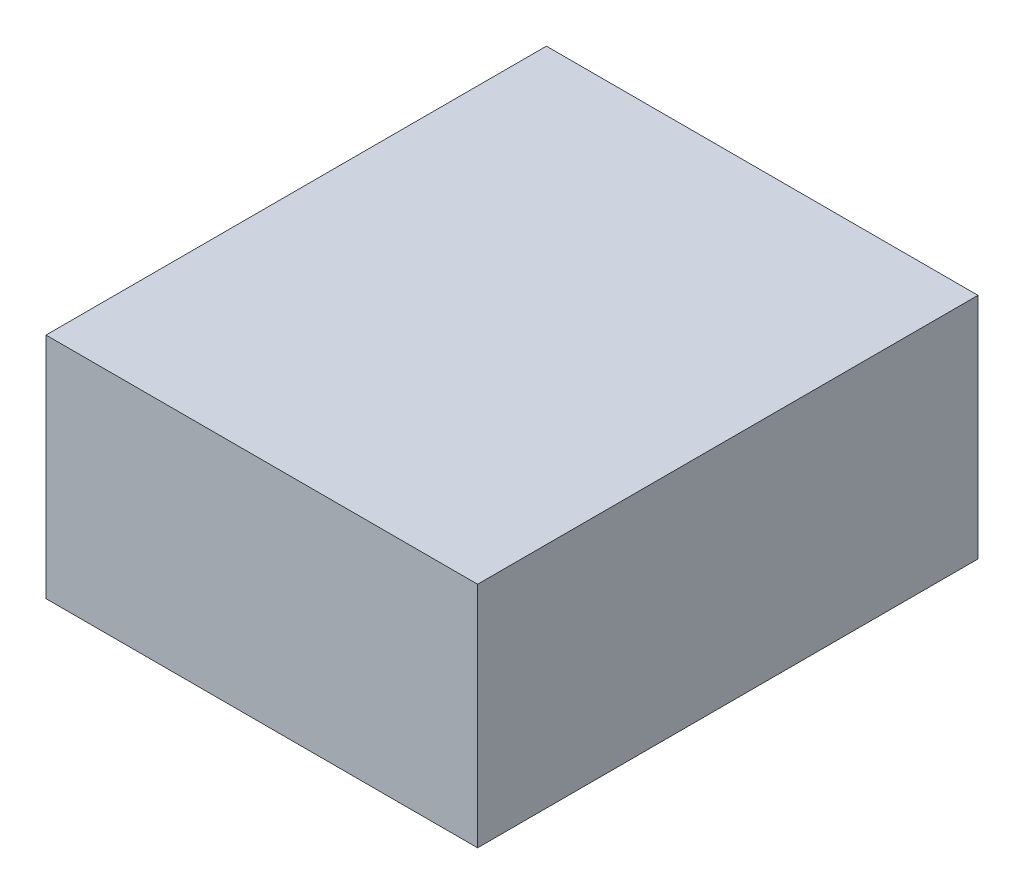
ISO-10303-21;
HEADER;
FILE_DESCRIPTION(('STEP AP214'),'2;1');
FILE_NAME('part.step','',(''),(''),'','','');
FILE_SCHEMA(('AUTOMOTIVE_DESIGN { 1 0 10303 214 1 1 1 1 }'));
ENDSEC;
DATA;
#1=APPLICATION_CONTEXT('core data for automotive mechanical design processes');
#2=APPLICATION_PROTOCOL_DEFINITION('international standard','automotive_design',2000,#1);
#3=PRODUCT_CONTEXT('',#1,'mechanical');
#4=PRODUCT('Part','Part','',(#3));
#5=PRODUCT_RELATED_PRODUCT_CATEGORY('part','',(#4));
#6=PRODUCT_DEFINITION_FORMATION('','',#4);
#7=PRODUCT_DEFINITION_CONTEXT('part definition',#1,'design');
#8=PRODUCT_DEFINITION('design','',#6,#7);
#9=PRODUCT_DEFINITION_SHAPE('','',#8);
#10=(LENGTH_UNIT() NAMED_UNIT(*) SI_UNIT(.MILLI.,.METRE.));
#11=(NAMED_UNIT(*) PLANE_ANGLE_UNIT() SI_UNIT($,.RADIAN.));
#12=(NAMED_UNIT(*) SI_UNIT($,.STERADIAN.) SOLID_ANGLE_UNIT());
#13=UNCERTAINTY_MEASURE_WITH_UNIT(LENGTH_MEASURE(1.E-05),#10,'distance_accuracy_value','');
#14=(GEOMETRIC_REPRESENTATION_CONTEXT(3) GLOBAL_UNCERTAINTY_ASSIGNED_CONTEXT((#13)) GLOBAL_UNIT_ASSIGNED_CONTEXT((#10,
#11,#12)) REPRESENTATION_CONTEXT('',''));
#15=CARTESIAN_POINT('',(0.,0.,0.));
#16=DIRECTION('',(0.,0.,1.));
#17=DIRECTION('',(1.,0.,0.));
#18=AXIS2_PLACEMENT_3D('',#15,#16,#17);
#19=CARTESIAN_POINT('',(3.175,0.,508.));
#20=DIRECTION('',(-1.,0.,0.));
#21=DIRECTION('',(0.,0.,1.));
#22=AXIS2_PLACEMENT_3D('',#19,#20,#21);
#23=PLANE('',#22);
#24=DIRECTION('',(0.,1.,0.));
#25=VECTOR('',#24,1.);
#26=CARTESIAN_POINT('',(3.175,0.,504.825));
#27=LINE('',#26,#25);
#28=CARTESIAN_POINT('',(3.17499999999998,-127.,504.825));
#29=VERTEX_POINT('',#28);
#30=CARTESIAN_POINT('',(3.175,101.6,504.825));
#31=VERTEX_POINT('',#30);
#32=EDGE_CURVE('E137',#29,#31,#27,.T.);
#33=ORIENTED_EDGE('',*,*,#32,.F.);
#34=DIRECTION('',(0.,0.,-1.));
#35=VECTOR('',#34,1.);
#36=CARTESIAN_POINT('',(3.17499999999998,-127.,165.1));
#37=LINE('',#36,#35);
#38=CARTESIAN_POINT('',(3.17499999999998,-127.,165.1));
#39=VERTEX_POINT('',#38);
#40=EDGE_CURVE('E147',#29,#39,#37,.T.);
#41=ORIENTED_EDGE('',*,*,#40,.T.);
#42=DIRECTION('',(0.,1.,0.));
#43=VECTOR('',#42,1.);
#44=CARTESIAN_POINT('',(3.17499999999998,-76.2,165.1));
#45=LINE('',#44,#43);
#46=CARTESIAN_POINT('',(3.17499999999998,-76.2,165.1));
#47=VERTEX_POINT('',#46);
#48=EDGE_CURVE('E159',#39,#47,#45,.T.);
#49=ORIENTED_EDGE('',*,*,#48,.T.);
#50=DIRECTION('',(0.,0.,-1.));
#51=VECTOR('',#50,1.);
#52=CARTESIAN_POINT('',(3.17499999999998,-76.2,139.7));
#53=LINE('',#52,#51);
#54=CARTESIAN_POINT('',(3.17499999999998,-76.2,139.7));
#55=VERTEX_POINT('',#54);
#56=EDGE_CURVE('E161',#47,#55,#53,.T.);
#57=ORIENTED_EDGE('',*,*,#56,.T.);
#58=CARTESIAN_POINT('',(3.17499999999998,-76.2,63.5));
#59=DIRECTION('',(-1.,0.,0.));
#60=DIRECTION('',(0.,0.,1.));
#61=AXIS2_PLACEMENT_3D('',#58,#59,#60);
#62=CIRCLE('',#61,76.2);
#63=CARTESIAN_POINT('',(3.17499999999998,0.,63.5));
#64=VERTEX_POINT('',#63);
#65=EDGE_CURVE('E158',#55,#64,#62,.T.);
#66=ORIENTED_EDGE('',*,*,#65,.T.);
#67=DIRECTION('',(0.,0.,-1.));
#68=VECTOR('',#67,1.);
#69=CARTESIAN_POINT('',(3.175,0.,508.));
#70=LINE('',#69,#68);
#71=CARTESIAN_POINT('',(3.175,0.,0.));
#72=VERTEX_POINT('',#71);
#73=EDGE_CURVE('E48',#64,#72,#70,.T.);
#74=ORIENTED_EDGE('',*,*,#73,.T.);
#75=DIRECTION('',(0.,1.,0.));
#76=VECTOR('',#75,1.);
#77=CARTESIAN_POINT('',(3.175,0.,0.));
#78=LINE('',#77,#76);
#79=CARTESIAN_POINT('',(3.175,101.6,0.));
#80=VERTEX_POINT('',#79);
#81=EDGE_CURVE('E197',#72,#80,#78,.T.);
#82=ORIENTED_EDGE('',*,*,#81,.T.);
#83=DIRECTION('',(0.,0.,-1.));
#84=VECTOR('',#83,1.);
#85=CARTESIAN_POINT('',(3.175,101.6,508.));
#86=LINE('',#85,#84);
#87=EDGE_CURVE('E150',#31,#80,#86,.T.);
#88=ORIENTED_EDGE('',*,*,#87,.F.);
#89=EDGE_LOOP('',(#33,#41,#49,#57,#66,#74,#82,#88));
#90=FACE_BOUND('',#89,.T.);
#91=ADVANCED_FACE('F39',(#90),#23,.F.);
#92=CARTESIAN_POINT('',(3.175,101.6,508.));
#93=DIRECTION('',(0.,1.,0.));
#94=DIRECTION('',(0.,0.,1.));
#95=AXIS2_PLACEMENT_3D('',#92,#93,#94);
#96=PLANE('',#95);
#97=DIRECTION('',(1.,0.,0.));
#98=VECTOR('',#97,1.);
#99=CARTESIAN_POINT('',(3.175,101.6,504.825));
#100=LINE('',#99,#98);
#101=CARTESIAN_POINT('',(434.975,101.6,504.825));
#102=VERTEX_POINT('',#101);
#103=EDGE_CURVE('E152',#31,#102,#100,.T.);
#104=ORIENTED_EDGE('',*,*,#103,.F.);
#105=ORIENTED_EDGE('',*,*,#87,.T.);
#106=DIRECTION('',(1.,0.,0.));
#107=VECTOR('',#106,1.);
#108=CARTESIAN_POINT('',(3.175,101.6,0.));
#109=LINE('',#108,#107);
#110=CARTESIAN_POINT('',(434.975,101.6,0.));
#111=VERTEX_POINT('',#110);
#112=EDGE_CURVE('E199',#80,#111,#109,.T.);
#113=ORIENTED_EDGE('',*,*,#112,.T.);
#114=DIRECTION('',(0.,0.,-1.));
#115=VECTOR('',#114,1.);
#116=CARTESIAN_POINT('',(434.975,101.6,508.));
#117=LINE('',#116,#115);
#118=EDGE_CURVE('E217',#102,#111,#117,.T.);
#119=ORIENTED_EDGE('',*,*,#118,.F.);
#120=EDGE_LOOP('',(#104,#105,#113,#119));
#121=FACE_BOUND('',#120,.T.);
#122=ADVANCED_FACE('F235',(#121),#96,.F.);
#123=CARTESIAN_POINT('',(434.975,101.6,508.));
#124=DIRECTION('',(1.,0.,0.));
#125=DIRECTION('',(0.,1.,0.));
#126=AXIS2_PLACEMENT_3D('',#123,#124,#125);
#127=PLANE('',#126);
#128=DIRECTION('',(0.,-1.,0.));
#129=VECTOR('',#128,1.);
#130=CARTESIAN_POINT('',(434.975,101.6,504.825));
#131=LINE('',#130,#129);
#132=CARTESIAN_POINT('',(434.975,-127.,504.825));
#133=VERTEX_POINT('',#132);
#134=EDGE_CURVE('E140',#102,#133,#131,.T.);
#135=ORIENTED_EDGE('',*,*,#134,.F.);
#136=ORIENTED_EDGE('',*,*,#118,.T.);
#137=DIRECTION('',(0.,-1.,0.));
#138=VECTOR('',#137,1.);
#139=CARTESIAN_POINT('',(434.975,101.6,0.));
#140=LINE('',#139,#138);
#141=CARTESIAN_POINT('',(434.975,-127.,0.));
#142=VERTEX_POINT('',#141);
#143=EDGE_CURVE('E202',#111,#142,#140,.T.);
#144=ORIENTED_EDGE('',*,*,#143,.T.);
#145=DIRECTION('',(0.,0.,-1.));
#146=VECTOR('',#145,1.);
#147=CARTESIAN_POINT('',(434.975,-127.,508.));
#148=LINE('',#147,#146);
#149=EDGE_CURVE('E215',#133,#142,#148,.T.);
#150=ORIENTED_EDGE('',*,*,#149,.F.);
#151=EDGE_LOOP('',(#135,#136,#144,#150));
#152=FACE_BOUND('',#151,.T.);
#153=ADVANCED_FACE('F239',(#152),#127,.F.);
#154=CARTESIAN_POINT('',(0.,0.,508.));
#155=DIRECTION('',(0.,1.,0.));
#156=DIRECTION('',(0.,0.,1.));
#157=AXIS2_PLACEMENT_3D('',#154,#155,#156);
#158=PLANE('',#157);
#159=DIRECTION('',(-1.,0.,0.));
#160=VECTOR('',#159,1.);
#161=CARTESIAN_POINT('',(465.461977969313,0.,63.5));
#162=LINE('',#161,#160);
#163=CARTESIAN_POINT('',(0.,0.,63.5));
#164=VERTEX_POINT('',#163);
#165=EDGE_CURVE('E163',#64,#164,#162,.T.);
#166=ORIENTED_EDGE('',*,*,#165,.T.);
#167=DIRECTION('',(0.,0.,-1.));
#168=VECTOR('',#167,1.);
#169=CARTESIAN_POINT('',(0.,0.,508.));
#170=LINE('',#169,#168);
#171=CARTESIAN_POINT('',(0.,0.,0.));
#172=VERTEX_POINT('',#171);
#173=EDGE_CURVE('E11',#164,#172,#170,.T.);
#174=ORIENTED_EDGE('',*,*,#173,.T.);
#175=DIRECTION('',(1.,0.,0.));
#176=VECTOR('',#175,1.);
#177=CARTESIAN_POINT('',(0.,0.,0.));
#178=LINE('',#177,#176);
#179=EDGE_CURVE('E194',#172,#72,#178,.T.);
#180=ORIENTED_EDGE('',*,*,#179,.T.);
#181=ORIENTED_EDGE('',*,*,#73,.F.);
#182=EDGE_LOOP('',(#166,#174,#180,#181));
#183=FACE_BOUND('',#182,.T.);
#184=ADVANCED_FACE('F226',(#183),#158,.F.);
#185=CARTESIAN_POINT('',(0.,104.775,508.));
#186=DIRECTION('',(1.,0.,0.));
#187=DIRECTION('',(0.,1.,0.));
#188=AXIS2_PLACEMENT_3D('',#185,#186,#187);
#189=PLANE('',#188);
#190=DIRECTION('',(0.,0.,-1.));
#191=VECTOR('',#190,1.);
#192=CARTESIAN_POINT('',(0.,104.775,508.));
#193=LINE('',#192,#191);
#194=CARTESIAN_POINT('',(0.,104.775,508.));
#195=VERTEX_POINT('',#194);
#196=CARTESIAN_POINT('',(0.,104.775,0.));
#197=VERTEX_POINT('',#196);
#198=EDGE_CURVE('E90',#195,#197,#193,.T.);
#199=ORIENTED_EDGE('',*,*,#198,.T.);
#200=DIRECTION('',(0.,-1.,0.));
#201=VECTOR('',#200,1.);
#202=CARTESIAN_POINT('',(0.,104.775,0.));
#203=LINE('',#202,#201);
#204=EDGE_CURVE('E185',#197,#172,#203,.T.);
#205=ORIENTED_EDGE('',*,*,#204,.T.);
#206=ORIENTED_EDGE('',*,*,#173,.F.);
#207=CARTESIAN_POINT('',(0.,-76.2,63.5));
#208=DIRECTION('',(1.,0.,0.));
#209=DIRECTION('',(0.,1.,0.));
#210=AXIS2_PLACEMENT_3D('',#207,#208,#209);
#211=CIRCLE('',#210,76.2);
#212=CARTESIAN_POINT('',(0.,-76.2,139.7));
#213=VERTEX_POINT('',#212);
#214=EDGE_CURVE('E151',#164,#213,#211,.T.);
#215=ORIENTED_EDGE('',*,*,#214,.T.);
#216=DIRECTION('',(0.,0.,1.));
#217=VECTOR('',#216,1.);
#218=CARTESIAN_POINT('',(0.,-76.2,139.7));
#219=LINE('',#218,#217);
#220=CARTESIAN_POINT('',(0.,-76.2,165.1));
#221=VERTEX_POINT('',#220);
#222=EDGE_CURVE('E168',#213,#221,#219,.T.);
#223=ORIENTED_EDGE('',*,*,#222,.T.);
#224=DIRECTION('',(0.,-1.,0.));
#225=VECTOR('',#224,1.);
#226=CARTESIAN_POINT('',(0.,-76.2,165.1));
#227=LINE('',#226,#225);
#228=CARTESIAN_POINT('',(0.,-127.,165.1));
#229=VERTEX_POINT('',#228);
#230=EDGE_CURVE('E171',#221,#229,#227,.T.);
#231=ORIENTED_EDGE('',*,*,#230,.T.);
#232=DIRECTION('',(0.,0.,1.));
#233=VECTOR('',#232,1.);
#234=CARTESIAN_POINT('',(0.,-127.,165.1));
#235=LINE('',#234,#233);
#236=CARTESIAN_POINT('',(0.,-127.,508.));
#237=VERTEX_POINT('',#236);
#238=EDGE_CURVE('E174',#229,#237,#235,.T.);
#239=ORIENTED_EDGE('',*,*,#238,.T.);
#240=DIRECTION('',(0.,-1.,0.));
#241=VECTOR('',#240,1.);
#242=CARTESIAN_POINT('',(0.,104.775,508.));
#243=LINE('',#242,#241);
#244=EDGE_CURVE('E186',#195,#237,#243,.T.);
#245=ORIENTED_EDGE('',*,*,#244,.F.);
#246=EDGE_LOOP('',(#199,#205,#206,#215,#223,#231,#239,#245));
#247=FACE_BOUND('',#246,.T.);
#248=ADVANCED_FACE('F41',(#247),#189,.F.);
#249=CARTESIAN_POINT('',(434.975,-127.,508.));
#250=DIRECTION('',(0.,1.,0.));
#251=DIRECTION('',(0.,0.,1.));
#252=AXIS2_PLACEMENT_3D('',#249,#250,#251);
#253=PLANE('',#252);
#254=DIRECTION('',(1.,0.,0.));
#255=VECTOR('',#254,1.);
#256=CARTESIAN_POINT('',(434.975,-127.,508.));
#257=LINE('',#256,#255);
#258=CARTESIAN_POINT('',(438.15,-127.,508.));
#259=VERTEX_POINT('',#258);
#260=EDGE_CURVE('E93',#237,#259,#257,.T.);
#261=ORIENTED_EDGE('',*,*,#260,.F.);
#262=ORIENTED_EDGE('',*,*,#238,.F.);
#263=DIRECTION('',(-1.,0.,0.));
#264=VECTOR('',#263,1.);
#265=CARTESIAN_POINT('',(465.461977969313,-127.,165.1));
#266=LINE('',#265,#264);
#267=EDGE_CURVE('E157',#39,#229,#266,.T.);
#268=ORIENTED_EDGE('',*,*,#267,.F.);
#269=ORIENTED_EDGE('',*,*,#40,.F.);
#270=DIRECTION('',(1.,0.,0.));
#271=VECTOR('',#270,1.);
#272=CARTESIAN_POINT('',(0.,-127.,504.825));
#273=LINE('',#272,#271);
#274=EDGE_CURVE('E134',#29,#133,#273,.T.);
#275=ORIENTED_EDGE('',*,*,#274,.T.);
#276=ORIENTED_EDGE('',*,*,#149,.T.);
#277=DIRECTION('',(1.,0.,0.));
#278=VECTOR('',#277,1.);
#279=CARTESIAN_POINT('',(434.975,-127.,0.));
#280=LINE('',#279,#278);
#281=CARTESIAN_POINT('',(438.15,-127.,0.));
#282=VERTEX_POINT('',#281);
#283=EDGE_CURVE('E205',#142,#282,#280,.T.);
#284=ORIENTED_EDGE('',*,*,#283,.T.);
#285=DIRECTION('',(0.,0.,-1.));
#286=VECTOR('',#285,1.);
#287=CARTESIAN_POINT('',(438.15,-127.,508.));
#288=LINE('',#287,#286);
#289=EDGE_CURVE('E213',#259,#282,#288,.T.);
#290=ORIENTED_EDGE('',*,*,#289,.F.);
#291=EDGE_LOOP('',(#261,#262,#268,#269,#275,#276,#284,#290));
#292=FACE_BOUND('',#291,.T.);
#293=ADVANCED_FACE('F155',(#292),#253,.F.);
#294=CARTESIAN_POINT('',(438.15,-127.,508.));
#295=DIRECTION('',(-1.,0.,0.));
#296=DIRECTION('',(0.,-1.,0.));
#297=AXIS2_PLACEMENT_3D('',#294,#295,#296);
#298=PLANE('',#297);
#299=ORIENTED_EDGE('',*,*,#289,.T.);
#300=DIRECTION('',(0.,1.,0.));
#301=VECTOR('',#300,1.);
#302=CARTESIAN_POINT('',(438.15,-127.,0.));
#303=LINE('',#302,#301);
#304=CARTESIAN_POINT('',(438.15,104.775,0.));
#305=VERTEX_POINT('',#304);
#306=EDGE_CURVE('E208',#282,#305,#303,.T.);
#307=ORIENTED_EDGE('',*,*,#306,.T.);
#308=DIRECTION('',(0.,0.,-1.));
#309=VECTOR('',#308,1.);
#310=CARTESIAN_POINT('',(438.15,104.775,508.));
#311=LINE('',#310,#309);
#312=CARTESIAN_POINT('',(438.15,104.775,508.));
#313=VERTEX_POINT('',#312);
#314=EDGE_CURVE('E84',#313,#305,#311,.T.);
#315=ORIENTED_EDGE('',*,*,#314,.F.);
#316=DIRECTION('',(0.,1.,0.));
#317=VECTOR('',#316,1.);
#318=CARTESIAN_POINT('',(438.15,-127.,508.));
#319=LINE('',#318,#317);
#320=EDGE_CURVE('E190',#259,#313,#319,.T.);
#321=ORIENTED_EDGE('',*,*,#320,.F.);
#322=EDGE_LOOP('',(#299,#307,#315,#321));
#323=FACE_BOUND('',#322,.T.);
#324=ADVANCED_FACE('F244',(#323),#298,.F.);
#325=CARTESIAN_POINT('',(438.15,104.775,508.));
#326=DIRECTION('',(0.,-1.,0.));
#327=DIRECTION('',(1.,0.,0.));
#328=AXIS2_PLACEMENT_3D('',#325,#326,#327);
#329=PLANE('',#328);
#330=ORIENTED_EDGE('',*,*,#314,.T.);
#331=DIRECTION('',(-1.,0.,0.));
#332=VECTOR('',#331,1.);
#333=CARTESIAN_POINT('',(438.15,104.775,0.));
#334=LINE('',#333,#332);
#335=EDGE_CURVE('E188',#305,#197,#334,.T.);
#336=ORIENTED_EDGE('',*,*,#335,.T.);
#337=ORIENTED_EDGE('',*,*,#198,.F.);
#338=DIRECTION('',(-1.,0.,0.));
#339=VECTOR('',#338,1.);
#340=CARTESIAN_POINT('',(438.15,104.775,508.));
#341=LINE('',#340,#339);
#342=EDGE_CURVE('E56',#313,#195,#341,.T.);
#343=ORIENTED_EDGE('',*,*,#342,.F.);
#344=EDGE_LOOP('',(#330,#336,#337,#343));
#345=FACE_BOUND('',#344,.T.);
#346=ADVANCED_FACE('F247',(#345),#329,.F.);
#347=CARTESIAN_POINT('',(0.,0.,508.));
#348=DIRECTION('',(0.,0.,1.));
#349=DIRECTION('',(1.,0.,0.));
#350=AXIS2_PLACEMENT_3D('',#347,#348,#349);
#351=PLANE('',#350);
#352=ORIENTED_EDGE('',*,*,#244,.T.);
#353=ORIENTED_EDGE('',*,*,#260,.T.);
#354=ORIENTED_EDGE('',*,*,#320,.T.);
#355=ORIENTED_EDGE('',*,*,#342,.T.);
#356=EDGE_LOOP('',(#352,#353,#354,#355));
#357=FACE_BOUND('',#356,.T.);
#358=ADVANCED_FACE('F245',(#357),#351,.T.);
#359=CARTESIAN_POINT('',(0.,0.,0.));
#360=DIRECTION('',(0.,0.,1.));
#361=DIRECTION('',(1.,0.,0.));
#362=AXIS2_PLACEMENT_3D('',#359,#360,#361);
#363=PLANE('',#362);
#364=ORIENTED_EDGE('',*,*,#204,.F.);
#365=ORIENTED_EDGE('',*,*,#335,.F.);
#366=ORIENTED_EDGE('',*,*,#306,.F.);
#367=ORIENTED_EDGE('',*,*,#283,.F.);
#368=ORIENTED_EDGE('',*,*,#143,.F.);
#369=ORIENTED_EDGE('',*,*,#112,.F.);
#370=ORIENTED_EDGE('',*,*,#81,.F.);
#371=ORIENTED_EDGE('',*,*,#179,.F.);
#372=EDGE_LOOP('',(#364,#365,#366,#367,#368,#369,#370,#371));
#373=FACE_BOUND('',#372,.T.);
#374=ADVANCED_FACE('F230',(#373),#363,.F.);
#375=CARTESIAN_POINT('',(465.461977969313,-76.2,63.5));
#376=DIRECTION('',(-1.,0.,0.));
#377=DIRECTION('',(0.,-1.,0.));
#378=AXIS2_PLACEMENT_3D('',#375,#376,#377);
#379=CYLINDRICAL_SURFACE('',#378,76.2);
#380=ORIENTED_EDGE('',*,*,#65,.F.);
#381=DIRECTION('',(-1.,0.,0.));
#382=VECTOR('',#381,1.);
#383=CARTESIAN_POINT('',(465.461977969313,-76.2,139.7));
#384=LINE('',#383,#382);
#385=EDGE_CURVE('E177',#55,#213,#384,.T.);
#386=ORIENTED_EDGE('',*,*,#385,.T.);
#387=ORIENTED_EDGE('',*,*,#214,.F.);
#388=ORIENTED_EDGE('',*,*,#165,.F.);
#389=EDGE_LOOP('',(#380,#386,#387,#388));
#390=FACE_BOUND('',#389,.T.);
#391=ADVANCED_FACE('F254',(#390),#379,.F.);
#392=CARTESIAN_POINT('',(465.461977969313,-76.2,165.1));
#393=DIRECTION('',(0.,0.,-1.));
#394=DIRECTION('',(-1.,0.,0.));
#395=AXIS2_PLACEMENT_3D('',#392,#393,#394);
#396=PLANE('',#395);
#397=ORIENTED_EDGE('',*,*,#48,.F.);
#398=ORIENTED_EDGE('',*,*,#267,.T.);
#399=ORIENTED_EDGE('',*,*,#230,.F.);
#400=DIRECTION('',(-1.,0.,0.));
#401=VECTOR('',#400,1.);
#402=CARTESIAN_POINT('',(465.461977969313,-76.2,165.1));
#403=LINE('',#402,#401);
#404=EDGE_CURVE('E181',#47,#221,#403,.T.);
#405=ORIENTED_EDGE('',*,*,#404,.F.);
#406=EDGE_LOOP('',(#397,#398,#399,#405));
#407=FACE_BOUND('',#406,.T.);
#408=ADVANCED_FACE('F356',(#407),#396,.T.);
#409=CARTESIAN_POINT('',(465.461977969313,-76.2,139.7));
#410=DIRECTION('',(0.,-1.,0.));
#411=DIRECTION('',(1.,0.,0.));
#412=AXIS2_PLACEMENT_3D('',#409,#410,#411);
#413=PLANE('',#412);
#414=ORIENTED_EDGE('',*,*,#56,.F.);
#415=ORIENTED_EDGE('',*,*,#404,.T.);
#416=ORIENTED_EDGE('',*,*,#222,.F.);
#417=ORIENTED_EDGE('',*,*,#385,.F.);
#418=EDGE_LOOP('',(#414,#415,#416,#417));
#419=FACE_BOUND('',#418,.T.);
#420=ADVANCED_FACE('F343',(#419),#413,.T.);
#421=CARTESIAN_POINT('',(0.,0.,504.825));
#422=DIRECTION('',(0.,0.,1.));
#423=DIRECTION('',(1.,0.,0.));
#424=AXIS2_PLACEMENT_3D('',#421,#422,#423);
#425=PLANE('',#424);
#426=ORIENTED_EDGE('',*,*,#274,.F.);
#427=ORIENTED_EDGE('',*,*,#32,.T.);
#428=ORIENTED_EDGE('',*,*,#103,.T.);
#429=ORIENTED_EDGE('',*,*,#134,.T.);
#430=EDGE_LOOP('',(#426,#427,#428,#429));
#431=FACE_BOUND('',#430,.T.);
#432=ADVANCED_FACE('F136',(#431),#425,.F.);
#433=CLOSED_SHELL('',(#91,#122,#153,#184,#248,#293,#324,#346,#358,#374,#391,#408,#420,#432));
#434=MANIFOLD_SOLID_BREP('B2',#433);
#435=ADVANCED_BREP_SHAPE_REPRESENTATION('',(#18,#434),#14);
#436=SHAPE_DEFINITION_REPRESENTATION(#9,#435);
ENDSEC;
END-ISO-10303-21;
